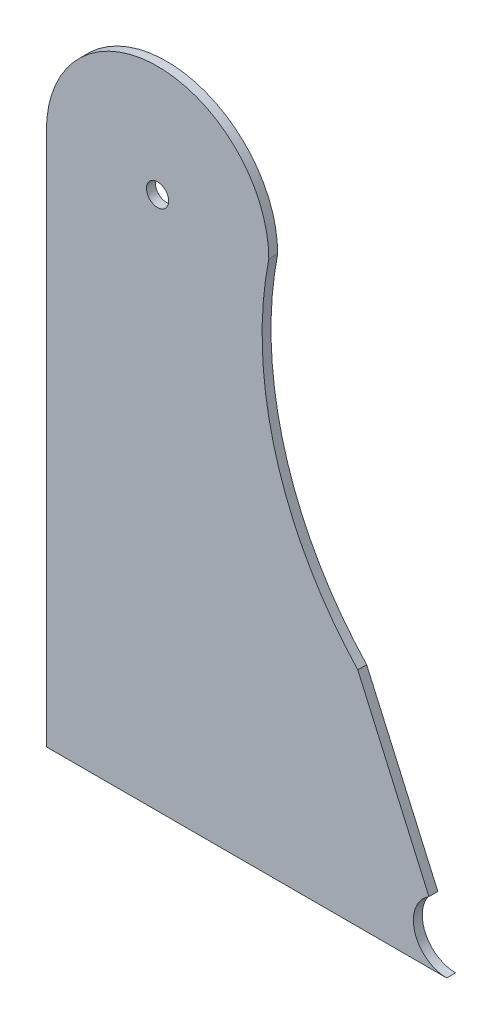
ISO-10303-21;
HEADER;
FILE_DESCRIPTION(('STEP AP214'),'2;1');
FILE_NAME('part.step','',(''),(''),'','','');
FILE_SCHEMA(('AUTOMOTIVE_DESIGN { 1 0 10303 214 1 1 1 1 }'));
ENDSEC;
DATA;
#1=APPLICATION_CONTEXT('core data for automotive mechanical design processes');
#2=APPLICATION_PROTOCOL_DEFINITION('international standard','automotive_design',2000,#1);
#3=PRODUCT_CONTEXT('',#1,'mechanical');
#4=PRODUCT('Part','Part','',(#3));
#5=PRODUCT_RELATED_PRODUCT_CATEGORY('part','',(#4));
#6=PRODUCT_DEFINITION_FORMATION('','',#4);
#7=PRODUCT_DEFINITION_CONTEXT('part definition',#1,'design');
#8=PRODUCT_DEFINITION('design','',#6,#7);
#9=PRODUCT_DEFINITION_SHAPE('','',#8);
#10=(LENGTH_UNIT() NAMED_UNIT(*) SI_UNIT(.MILLI.,.METRE.));
#11=(NAMED_UNIT(*) PLANE_ANGLE_UNIT() SI_UNIT($,.RADIAN.));
#12=(NAMED_UNIT(*) SI_UNIT($,.STERADIAN.) SOLID_ANGLE_UNIT());
#13=UNCERTAINTY_MEASURE_WITH_UNIT(LENGTH_MEASURE(1.E-05),#10,'distance_accuracy_value','');
#14=(GEOMETRIC_REPRESENTATION_CONTEXT(3) GLOBAL_UNCERTAINTY_ASSIGNED_CONTEXT((#13)) GLOBAL_UNIT_ASSIGNED_CONTEXT((#10,
#11,#12)) REPRESENTATION_CONTEXT('',''));
#15=CARTESIAN_POINT('',(0.,0.,0.));
#16=DIRECTION('',(0.,0.,1.));
#17=DIRECTION('',(1.,0.,0.));
#18=AXIS2_PLACEMENT_3D('',#15,#16,#17);
#19=CARTESIAN_POINT('',(-82.55,152.4,2.54));
#20=DIRECTION('',(0.,0.,-1.));
#21=DIRECTION('',(-1.,0.,0.));
#22=AXIS2_PLACEMENT_3D('',#19,#20,#21);
#23=PLANE('',#22);
#24=DIRECTION('',(0.,-1.,0.));
#25=VECTOR('',#24,1.);
#26=CARTESIAN_POINT('',(-114.3,0.,2.54));
#27=LINE('',#26,#25);
#28=CARTESIAN_POINT('',(-114.3,152.4,2.54));
#29=VERTEX_POINT('',#28);
#30=CARTESIAN_POINT('',(-114.3,0.,2.54));
#31=VERTEX_POINT('',#30);
#32=EDGE_CURVE('E146',#29,#31,#27,.T.);
#33=ORIENTED_EDGE('',*,*,#32,.T.);
#34=DIRECTION('',(1.,0.,0.));
#35=VECTOR('',#34,1.);
#36=CARTESIAN_POINT('',(0.,0.,2.54));
#37=LINE('',#36,#35);
#38=CARTESIAN_POINT('',(0.,0.,2.54));
#39=VERTEX_POINT('',#38);
#40=EDGE_CURVE('E94',#31,#39,#37,.T.);
#41=ORIENTED_EDGE('',*,*,#40,.T.);
#42=CARTESIAN_POINT('',(0.,9.525,2.54));
#43=DIRECTION('',(0.,0.,-1.));
#44=DIRECTION('',(1.,0.,0.));
#45=AXIS2_PLACEMENT_3D('',#42,#43,#44);
#46=CIRCLE('',#45,9.525);
#47=CARTESIAN_POINT('',(-5.08000000000003,17.5822467381854,2.54));
#48=VERTEX_POINT('',#47);
#49=EDGE_CURVE('E107',#39,#48,#46,.T.);
#50=ORIENTED_EDGE('',*,*,#49,.T.);
#51=DIRECTION('',(-0.40467631297698,0.914459994595366,0.));
#52=VECTOR('',#51,1.);
#53=CARTESIAN_POINT('',(-5.08000000000003,17.5822467381854,2.54));
#54=LINE('',#53,#52);
#55=CARTESIAN_POINT('',(-25.4,63.5,2.54));
#56=VERTEX_POINT('',#55);
#57=EDGE_CURVE('E101',#48,#56,#54,.T.);
#58=ORIENTED_EDGE('',*,*,#57,.T.);
#59=CARTESIAN_POINT('',(48.8925075390089,132.805002154003,2.54));
#60=DIRECTION('',(0.,0.,-1.));
#61=DIRECTION('',(1.,0.,0.));
#62=AXIS2_PLACEMENT_3D('',#59,#60,#61);
#63=CIRCLE('',#62,101.6);
#64=CARTESIAN_POINT('',(-50.8,152.4,2.54));
#65=VERTEX_POINT('',#64);
#66=EDGE_CURVE('E105',#56,#65,#63,.T.);
#67=ORIENTED_EDGE('',*,*,#66,.T.);
#68=CARTESIAN_POINT('',(-82.55,152.4,2.54));
#69=DIRECTION('',(0.,0.,1.));
#70=DIRECTION('',(-1.,0.,0.));
#71=AXIS2_PLACEMENT_3D('',#68,#69,#70);
#72=CIRCLE('',#71,31.75);
#73=EDGE_CURVE('E57',#65,#29,#72,.T.);
#74=ORIENTED_EDGE('',*,*,#73,.T.);
#75=EDGE_LOOP('',(#33,#41,#50,#58,#67,#74));
#76=FACE_BOUND('',#75,.T.);
#77=CARTESIAN_POINT('',(-82.55,152.4,2.54));
#78=DIRECTION('',(0.,0.,1.));
#79=DIRECTION('',(1.,0.,0.));
#80=AXIS2_PLACEMENT_3D('',#77,#78,#79);
#81=CIRCLE('',#80,3.175);
#82=CARTESIAN_POINT('',(-79.375,152.4,2.54));
#83=VERTEX_POINT('',#82);
#84=EDGE_CURVE('E134',#83,#83,#81,.T.);
#85=ORIENTED_EDGE('',*,*,#84,.F.);
#86=EDGE_LOOP('',(#85));
#87=FACE_BOUND('',#86,.T.);
#88=ADVANCED_FACE('F39',(#76,#87),#23,.F.);
#89=CARTESIAN_POINT('',(-82.55,152.4,0.));
#90=DIRECTION('',(0.,0.,-1.));
#91=DIRECTION('',(-1.,0.,0.));
#92=AXIS2_PLACEMENT_3D('',#89,#90,#91);
#93=PLANE('',#92);
#94=DIRECTION('',(0.,-1.,0.));
#95=VECTOR('',#94,1.);
#96=CARTESIAN_POINT('',(-114.3,0.,0.));
#97=LINE('',#96,#95);
#98=CARTESIAN_POINT('',(-114.3,152.4,0.));
#99=VERTEX_POINT('',#98);
#100=CARTESIAN_POINT('',(-114.3,0.,0.));
#101=VERTEX_POINT('',#100);
#102=EDGE_CURVE('E129',#99,#101,#97,.T.);
#103=ORIENTED_EDGE('',*,*,#102,.F.);
#104=CARTESIAN_POINT('',(-82.55,152.4,0.));
#105=DIRECTION('',(0.,0.,1.));
#106=DIRECTION('',(-1.,0.,0.));
#107=AXIS2_PLACEMENT_3D('',#104,#105,#106);
#108=CIRCLE('',#107,31.75);
#109=CARTESIAN_POINT('',(-50.8,152.4,0.));
#110=VERTEX_POINT('',#109);
#111=EDGE_CURVE('E86',#110,#99,#108,.T.);
#112=ORIENTED_EDGE('',*,*,#111,.F.);
#113=CARTESIAN_POINT('',(48.8925075390089,132.805002154003,0.));
#114=DIRECTION('',(0.,0.,-1.));
#115=DIRECTION('',(1.,0.,0.));
#116=AXIS2_PLACEMENT_3D('',#113,#114,#115);
#117=CIRCLE('',#116,101.6);
#118=CARTESIAN_POINT('',(-25.4,63.5,0.));
#119=VERTEX_POINT('',#118);
#120=EDGE_CURVE('E80',#119,#110,#117,.T.);
#121=ORIENTED_EDGE('',*,*,#120,.F.);
#122=DIRECTION('',(-0.40467631297698,0.914459994595366,0.));
#123=VECTOR('',#122,1.);
#124=CARTESIAN_POINT('',(-5.08000000000003,17.5822467381854,0.));
#125=LINE('',#124,#123);
#126=CARTESIAN_POINT('',(-5.08000000000003,17.5822467381854,0.));
#127=VERTEX_POINT('',#126);
#128=EDGE_CURVE('E116',#127,#119,#125,.T.);
#129=ORIENTED_EDGE('',*,*,#128,.F.);
#130=CARTESIAN_POINT('',(0.,9.525,0.));
#131=DIRECTION('',(0.,0.,-1.));
#132=DIRECTION('',(1.,0.,0.));
#133=AXIS2_PLACEMENT_3D('',#130,#131,#132);
#134=CIRCLE('',#133,9.525);
#135=CARTESIAN_POINT('',(0.,0.,0.));
#136=VERTEX_POINT('',#135);
#137=EDGE_CURVE('E137',#136,#127,#134,.T.);
#138=ORIENTED_EDGE('',*,*,#137,.F.);
#139=DIRECTION('',(1.,0.,0.));
#140=VECTOR('',#139,1.);
#141=CARTESIAN_POINT('',(0.,0.,0.));
#142=LINE('',#141,#140);
#143=EDGE_CURVE('E133',#101,#136,#142,.T.);
#144=ORIENTED_EDGE('',*,*,#143,.F.);
#145=EDGE_LOOP('',(#103,#112,#121,#129,#138,#144));
#146=FACE_BOUND('',#145,.T.);
#147=CARTESIAN_POINT('',(-82.55,152.4,0.));
#148=DIRECTION('',(0.,0.,1.));
#149=DIRECTION('',(1.,0.,0.));
#150=AXIS2_PLACEMENT_3D('',#147,#148,#149);
#151=CIRCLE('',#150,3.175);
#152=CARTESIAN_POINT('',(-79.375,152.4,0.));
#153=VERTEX_POINT('',#152);
#154=EDGE_CURVE('E243',#153,#153,#151,.T.);
#155=ORIENTED_EDGE('',*,*,#154,.T.);
#156=EDGE_LOOP('',(#155));
#157=FACE_BOUND('',#156,.T.);
#158=ADVANCED_FACE('F159',(#146,#157),#93,.T.);
#159=CARTESIAN_POINT('',(-114.3,0.,2.54));
#160=DIRECTION('',(1.,0.,0.));
#161=DIRECTION('',(0.,0.,-1.));
#162=AXIS2_PLACEMENT_3D('',#159,#160,#161);
#163=PLANE('',#162);
#164=ORIENTED_EDGE('',*,*,#102,.T.);
#165=DIRECTION('',(0.,0.,-1.));
#166=VECTOR('',#165,1.);
#167=CARTESIAN_POINT('',(-114.3,0.,2.54));
#168=LINE('',#167,#166);
#169=EDGE_CURVE('E11',#31,#101,#168,.T.);
#170=ORIENTED_EDGE('',*,*,#169,.F.);
#171=ORIENTED_EDGE('',*,*,#32,.F.);
#172=DIRECTION('',(0.,0.,-1.));
#173=VECTOR('',#172,1.);
#174=CARTESIAN_POINT('',(-114.3,152.4,2.54));
#175=LINE('',#174,#173);
#176=EDGE_CURVE('E125',#29,#99,#175,.T.);
#177=ORIENTED_EDGE('',*,*,#176,.T.);
#178=EDGE_LOOP('',(#164,#170,#171,#177));
#179=FACE_BOUND('',#178,.T.);
#180=ADVANCED_FACE('F41',(#179),#163,.F.);
#181=CARTESIAN_POINT('',(0.,0.,2.54));
#182=DIRECTION('',(0.,1.,0.));
#183=DIRECTION('',(-1.,0.,0.));
#184=AXIS2_PLACEMENT_3D('',#181,#182,#183);
#185=PLANE('',#184);
#186=ORIENTED_EDGE('',*,*,#143,.T.);
#187=DIRECTION('',(0.,0.,-1.));
#188=VECTOR('',#187,1.);
#189=CARTESIAN_POINT('',(0.,0.,2.54));
#190=LINE('',#189,#188);
#191=EDGE_CURVE('E49',#39,#136,#190,.T.);
#192=ORIENTED_EDGE('',*,*,#191,.F.);
#193=ORIENTED_EDGE('',*,*,#40,.F.);
#194=ORIENTED_EDGE('',*,*,#169,.T.);
#195=EDGE_LOOP('',(#186,#192,#193,#194));
#196=FACE_BOUND('',#195,.T.);
#197=ADVANCED_FACE('F184',(#196),#185,.F.);
#198=CARTESIAN_POINT('',(0.,9.525,2.54));
#199=DIRECTION('',(0.,0.,-1.));
#200=DIRECTION('',(-1.,0.,0.));
#201=AXIS2_PLACEMENT_3D('',#198,#199,#200);
#202=CYLINDRICAL_SURFACE('',#201,9.525);
#203=ORIENTED_EDGE('',*,*,#137,.T.);
#204=DIRECTION('',(0.,0.,-1.));
#205=VECTOR('',#204,1.);
#206=CARTESIAN_POINT('',(-5.08000000000003,17.5822467381854,2.54));
#207=LINE('',#206,#205);
#208=EDGE_CURVE('E118',#48,#127,#207,.T.);
#209=ORIENTED_EDGE('',*,*,#208,.F.);
#210=ORIENTED_EDGE('',*,*,#49,.F.);
#211=ORIENTED_EDGE('',*,*,#191,.T.);
#212=EDGE_LOOP('',(#203,#209,#210,#211));
#213=FACE_BOUND('',#212,.T.);
#214=ADVANCED_FACE('F156',(#213),#202,.F.);
#215=CARTESIAN_POINT('',(-5.08000000000003,17.5822467381854,2.54));
#216=DIRECTION('',(-0.914459994595366,-0.40467631297698,0.));
#217=DIRECTION('',(0.40467631297698,-0.914459994595366,0.));
#218=AXIS2_PLACEMENT_3D('',#215,#216,#217);
#219=PLANE('',#218);
#220=ORIENTED_EDGE('',*,*,#128,.T.);
#221=DIRECTION('',(0.,0.,-1.));
#222=VECTOR('',#221,1.);
#223=CARTESIAN_POINT('',(-25.4,63.5,2.54));
#224=LINE('',#223,#222);
#225=EDGE_CURVE('E113',#56,#119,#224,.T.);
#226=ORIENTED_EDGE('',*,*,#225,.F.);
#227=ORIENTED_EDGE('',*,*,#57,.F.);
#228=ORIENTED_EDGE('',*,*,#208,.T.);
#229=EDGE_LOOP('',(#220,#226,#227,#228));
#230=FACE_BOUND('',#229,.T.);
#231=ADVANCED_FACE('F114',(#230),#219,.F.);
#232=CARTESIAN_POINT('',(48.8925075390089,132.805002154003,2.54));
#233=DIRECTION('',(0.,0.,-1.));
#234=DIRECTION('',(-1.,0.,0.));
#235=AXIS2_PLACEMENT_3D('',#232,#233,#234);
#236=CYLINDRICAL_SURFACE('',#235,101.6);
#237=ORIENTED_EDGE('',*,*,#120,.T.);
#238=DIRECTION('',(0.,0.,-1.));
#239=VECTOR('',#238,1.);
#240=CARTESIAN_POINT('',(-50.8,152.4,2.54));
#241=LINE('',#240,#239);
#242=EDGE_CURVE('E119',#65,#110,#241,.T.);
#243=ORIENTED_EDGE('',*,*,#242,.F.);
#244=ORIENTED_EDGE('',*,*,#66,.F.);
#245=ORIENTED_EDGE('',*,*,#225,.T.);
#246=EDGE_LOOP('',(#237,#243,#244,#245));
#247=FACE_BOUND('',#246,.T.);
#248=ADVANCED_FACE('F121',(#247),#236,.F.);
#249=CARTESIAN_POINT('',(-82.55,152.4,2.54));
#250=DIRECTION('',(0.,0.,-1.));
#251=DIRECTION('',(-1.,0.,0.));
#252=AXIS2_PLACEMENT_3D('',#249,#250,#251);
#253=CYLINDRICAL_SURFACE('',#252,31.75);
#254=ORIENTED_EDGE('',*,*,#111,.T.);
#255=ORIENTED_EDGE('',*,*,#176,.F.);
#256=ORIENTED_EDGE('',*,*,#73,.F.);
#257=ORIENTED_EDGE('',*,*,#242,.T.);
#258=EDGE_LOOP('',(#254,#255,#256,#257));
#259=FACE_BOUND('',#258,.T.);
#260=ADVANCED_FACE('F164',(#259),#253,.T.);
#261=CARTESIAN_POINT('',(-82.55,152.4,2.54));
#262=DIRECTION('',(0.,0.,-1.));
#263=DIRECTION('',(-1.,0.,0.));
#264=AXIS2_PLACEMENT_3D('',#261,#262,#263);
#265=CYLINDRICAL_SURFACE('',#264,3.175);
#266=ORIENTED_EDGE('',*,*,#84,.T.);
#267=EDGE_LOOP('',(#266));
#268=FACE_BOUND('',#267,.T.);
#269=ORIENTED_EDGE('',*,*,#154,.F.);
#270=EDGE_LOOP('',(#269));
#271=FACE_BOUND('',#270,.T.);
#272=ADVANCED_FACE('F166',(#268,#271),#265,.F.);
#273=CLOSED_SHELL('',(#88,#158,#180,#197,#214,#231,#248,#260,#272));
#274=MANIFOLD_SOLID_BREP('B2',#273);
#275=ADVANCED_BREP_SHAPE_REPRESENTATION('',(#18,#274),#14);
#276=SHAPE_DEFINITION_REPRESENTATION(#9,#275);
ENDSEC;
END-ISO-10303-21;
